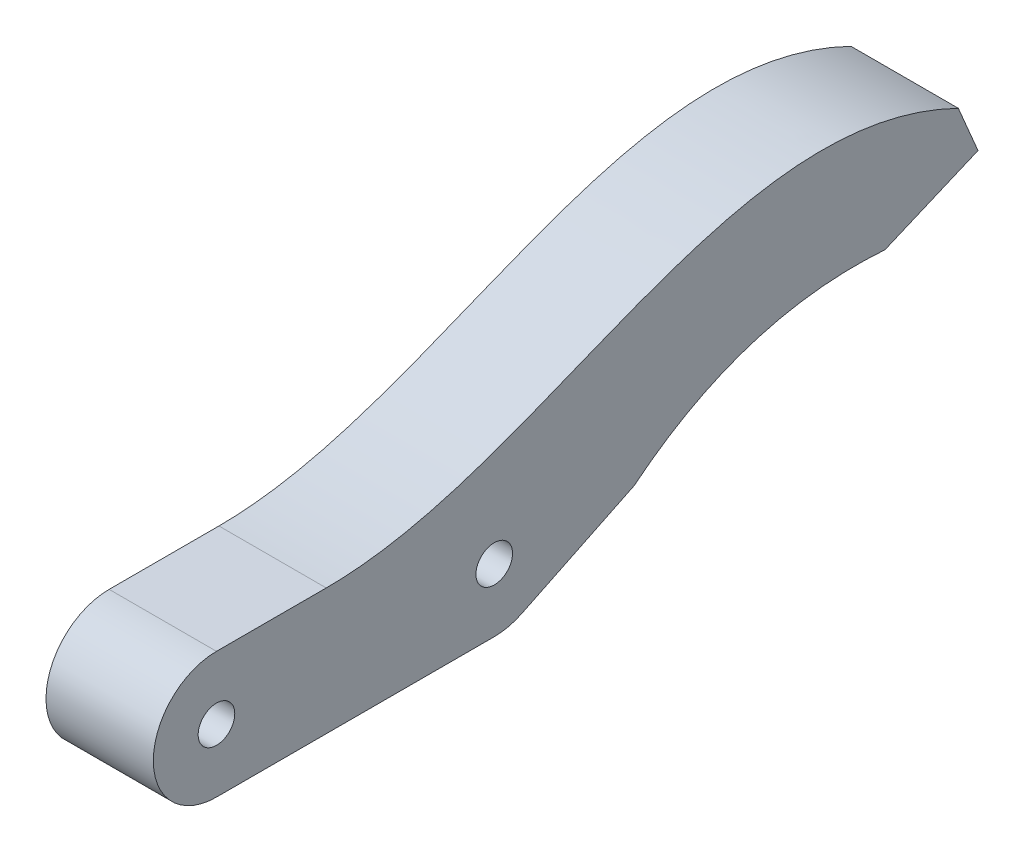
ISO-10303-21;
HEADER;
FILE_DESCRIPTION(('STEP AP214'),'2;1');
FILE_NAME('part.step','',(''),(''),'','','');
FILE_SCHEMA(('AUTOMOTIVE_DESIGN { 1 0 10303 214 1 1 1 1 }'));
ENDSEC;
DATA;
#1=APPLICATION_CONTEXT('core data for automotive mechanical design processes');
#2=APPLICATION_PROTOCOL_DEFINITION('international standard','automotive_design',2000,#1);
#3=PRODUCT_CONTEXT('',#1,'mechanical');
#4=PRODUCT('Part','Part','',(#3));
#5=PRODUCT_RELATED_PRODUCT_CATEGORY('part','',(#4));
#6=PRODUCT_DEFINITION_FORMATION('','',#4);
#7=PRODUCT_DEFINITION_CONTEXT('part definition',#1,'design');
#8=PRODUCT_DEFINITION('design','',#6,#7);
#9=PRODUCT_DEFINITION_SHAPE('','',#8);
#10=(LENGTH_UNIT() NAMED_UNIT(*) SI_UNIT(.MILLI.,.METRE.));
#11=(NAMED_UNIT(*) PLANE_ANGLE_UNIT() SI_UNIT($,.RADIAN.));
#12=(NAMED_UNIT(*) SI_UNIT($,.STERADIAN.) SOLID_ANGLE_UNIT());
#13=UNCERTAINTY_MEASURE_WITH_UNIT(LENGTH_MEASURE(1.E-05),#10,'distance_accuracy_value','');
#14=(GEOMETRIC_REPRESENTATION_CONTEXT(3) GLOBAL_UNCERTAINTY_ASSIGNED_CONTEXT((#13)) GLOBAL_UNIT_ASSIGNED_CONTEXT((#10,
#11,#12)) REPRESENTATION_CONTEXT('',''));
#15=CARTESIAN_POINT('',(0.,0.,0.));
#16=DIRECTION('',(0.,0.,1.));
#17=DIRECTION('',(1.,0.,0.));
#18=AXIS2_PLACEMENT_3D('',#15,#16,#17);
#19=CARTESIAN_POINT('',(8.5,5.,-27.));
#20=DIRECTION('',(-1.,0.,0.));
#21=DIRECTION('',(0.,0.,1.));
#22=AXIS2_PLACEMENT_3D('',#19,#20,#21);
#23=CYLINDRICAL_SURFACE('',#22,5.);
#24=DIRECTION('',(1.,0.,0.));
#25=VECTOR('',#24,1.);
#26=CARTESIAN_POINT('',(0.,0.502127655445501,-29.1838370754458));
#27=LINE('',#26,#25);
#28=CARTESIAN_POINT('',(0.,0.502127655445501,-29.1838370754458));
#29=VERTEX_POINT('',#28);
#30=CARTESIAN_POINT('',(8.5,0.502127655445501,-29.1838370754458));
#31=VERTEX_POINT('',#30);
#32=EDGE_CURVE('E197',#29,#31,#27,.T.);
#33=ORIENTED_EDGE('',*,*,#32,.T.);
#34=CARTESIAN_POINT('',(8.5,5.,-27.));
#35=DIRECTION('',(1.,0.,0.));
#36=DIRECTION('',(0.,0.,-1.));
#37=AXIS2_PLACEMENT_3D('',#34,#35,#36);
#38=CIRCLE('',#37,5.);
#39=CARTESIAN_POINT('',(8.5,0.,-27.));
#40=VERTEX_POINT('',#39);
#41=EDGE_CURVE('E209',#40,#31,#38,.T.);
#42=ORIENTED_EDGE('',*,*,#41,.F.);
#43=DIRECTION('',(-1.,0.,0.));
#44=VECTOR('',#43,1.);
#45=CARTESIAN_POINT('',(8.5,0.,-27.));
#46=LINE('',#45,#44);
#47=CARTESIAN_POINT('',(0.,0.,-27.));
#48=VERTEX_POINT('',#47);
#49=EDGE_CURVE('E217',#40,#48,#46,.T.);
#50=ORIENTED_EDGE('',*,*,#49,.T.);
#51=CARTESIAN_POINT('',(0.,5.,-27.));
#52=DIRECTION('',(1.,0.,0.));
#53=DIRECTION('',(0.,0.,-1.));
#54=AXIS2_PLACEMENT_3D('',#51,#52,#53);
#55=CIRCLE('',#54,5.);
#56=EDGE_CURVE('E221',#48,#29,#55,.T.);
#57=ORIENTED_EDGE('',*,*,#56,.T.);
#58=EDGE_LOOP('',(#33,#42,#50,#57));
#59=FACE_BOUND('',#58,.T.);
#60=ADVANCED_FACE('F42',(#59),#23,.T.);
#61=CARTESIAN_POINT('',(8.5,10.,0.));
#62=DIRECTION('',(0.,1.,0.));
#63=DIRECTION('',(0.,0.,1.));
#64=AXIS2_PLACEMENT_3D('',#61,#62,#63);
#65=PLANE('',#64);
#66=DIRECTION('',(1.,0.,0.));
#67=VECTOR('',#66,1.);
#68=CARTESIAN_POINT('',(0.,10.,-13.6949747586838));
#69=LINE('',#68,#67);
#70=CARTESIAN_POINT('',(0.,10.,-13.6949747586838));
#71=VERTEX_POINT('',#70);
#72=CARTESIAN_POINT('',(8.5,10.,-13.6949747586838));
#73=VERTEX_POINT('',#72);
#74=EDGE_CURVE('E132',#71,#73,#69,.T.);
#75=ORIENTED_EDGE('',*,*,#74,.F.);
#76=DIRECTION('',(0.,0.,-1.));
#77=VECTOR('',#76,1.);
#78=CARTESIAN_POINT('',(0.,10.,0.));
#79=LINE('',#78,#77);
#80=CARTESIAN_POINT('',(0.,10.,-5.));
#81=VERTEX_POINT('',#80);
#82=EDGE_CURVE('E143',#81,#71,#79,.T.);
#83=ORIENTED_EDGE('',*,*,#82,.F.);
#84=DIRECTION('',(-1.,0.,0.));
#85=VECTOR('',#84,1.);
#86=CARTESIAN_POINT('',(8.5,10.,-5.));
#87=LINE('',#86,#85);
#88=CARTESIAN_POINT('',(8.5,10.,-5.));
#89=VERTEX_POINT('',#88);
#90=EDGE_CURVE('E11',#89,#81,#87,.T.);
#91=ORIENTED_EDGE('',*,*,#90,.F.);
#92=DIRECTION('',(0.,0.,-1.));
#93=VECTOR('',#92,1.);
#94=CARTESIAN_POINT('',(8.5,10.,0.));
#95=LINE('',#94,#93);
#96=EDGE_CURVE('E196',#89,#73,#95,.T.);
#97=ORIENTED_EDGE('',*,*,#96,.T.);
#98=EDGE_LOOP('',(#75,#83,#91,#97));
#99=FACE_BOUND('',#98,.T.);
#100=ADVANCED_FACE('F44',(#99),#65,.T.);
#101=CARTESIAN_POINT('',(8.5,5.,-5.));
#102=DIRECTION('',(-1.,0.,0.));
#103=DIRECTION('',(0.,0.,1.));
#104=AXIS2_PLACEMENT_3D('',#101,#102,#103);
#105=CYLINDRICAL_SURFACE('',#104,5.);
#106=CARTESIAN_POINT('',(0.,5.,-5.));
#107=DIRECTION('',(1.,0.,0.));
#108=DIRECTION('',(0.,0.,-1.));
#109=AXIS2_PLACEMENT_3D('',#106,#107,#108);
#110=CIRCLE('',#109,5.);
#111=CARTESIAN_POINT('',(0.,0.,-5.));
#112=VERTEX_POINT('',#111);
#113=EDGE_CURVE('E72',#81,#112,#110,.T.);
#114=ORIENTED_EDGE('',*,*,#113,.T.);
#115=DIRECTION('',(-1.,0.,0.));
#116=VECTOR('',#115,1.);
#117=CARTESIAN_POINT('',(8.5,0.,-5.));
#118=LINE('',#117,#116);
#119=CARTESIAN_POINT('',(8.5,0.,-5.));
#120=VERTEX_POINT('',#119);
#121=EDGE_CURVE('E51',#120,#112,#118,.T.);
#122=ORIENTED_EDGE('',*,*,#121,.F.);
#123=CARTESIAN_POINT('',(8.5,5.,-5.));
#124=DIRECTION('',(1.,0.,0.));
#125=DIRECTION('',(0.,0.,-1.));
#126=AXIS2_PLACEMENT_3D('',#123,#124,#125);
#127=CIRCLE('',#126,5.);
#128=EDGE_CURVE('E205',#89,#120,#127,.T.);
#129=ORIENTED_EDGE('',*,*,#128,.F.);
#130=ORIENTED_EDGE('',*,*,#90,.T.);
#131=EDGE_LOOP('',(#114,#122,#129,#130));
#132=FACE_BOUND('',#131,.T.);
#133=ADVANCED_FACE('F188',(#132),#105,.T.);
#134=CARTESIAN_POINT('',(8.5,0.,0.));
#135=DIRECTION('',(0.,1.,0.));
#136=DIRECTION('',(0.,0.,1.));
#137=AXIS2_PLACEMENT_3D('',#134,#135,#136);
#138=PLANE('',#137);
#139=DIRECTION('',(0.,0.,-1.));
#140=VECTOR('',#139,1.);
#141=CARTESIAN_POINT('',(0.,0.,0.));
#142=LINE('',#141,#140);
#143=EDGE_CURVE('E77',#112,#48,#142,.T.);
#144=ORIENTED_EDGE('',*,*,#143,.T.);
#145=ORIENTED_EDGE('',*,*,#49,.F.);
#146=DIRECTION('',(0.,0.,-1.));
#147=VECTOR('',#146,1.);
#148=CARTESIAN_POINT('',(8.5,0.,0.));
#149=LINE('',#148,#147);
#150=EDGE_CURVE('E59',#120,#40,#149,.T.);
#151=ORIENTED_EDGE('',*,*,#150,.F.);
#152=ORIENTED_EDGE('',*,*,#121,.T.);
#153=EDGE_LOOP('',(#144,#145,#151,#152));
#154=FACE_BOUND('',#153,.T.);
#155=ADVANCED_FACE('F182',(#154),#138,.F.);
#156=CARTESIAN_POINT('',(8.5,5.,-5.));
#157=DIRECTION('',(-1.,0.,0.));
#158=DIRECTION('',(0.,0.,1.));
#159=AXIS2_PLACEMENT_3D('',#156,#157,#158);
#160=CYLINDRICAL_SURFACE('',#159,1.45);
#161=CARTESIAN_POINT('',(8.5,5.,-5.));
#162=DIRECTION('',(1.,0.,0.));
#163=DIRECTION('',(0.,0.,-1.));
#164=AXIS2_PLACEMENT_3D('',#161,#162,#163);
#165=CIRCLE('',#164,1.45);
#166=CARTESIAN_POINT('',(8.5,5.,-6.45));
#167=VERTEX_POINT('',#166);
#168=EDGE_CURVE('E211',#167,#167,#165,.T.);
#169=ORIENTED_EDGE('',*,*,#168,.T.);
#170=EDGE_LOOP('',(#169));
#171=FACE_BOUND('',#170,.T.);
#172=CARTESIAN_POINT('',(0.,5.,-5.));
#173=DIRECTION('',(1.,0.,0.));
#174=DIRECTION('',(0.,0.,-1.));
#175=AXIS2_PLACEMENT_3D('',#172,#173,#174);
#176=CIRCLE('',#175,1.45);
#177=CARTESIAN_POINT('',(0.,5.,-6.45));
#178=VERTEX_POINT('',#177);
#179=EDGE_CURVE('E224',#178,#178,#176,.T.);
#180=ORIENTED_EDGE('',*,*,#179,.F.);
#181=EDGE_LOOP('',(#180));
#182=FACE_BOUND('',#181,.T.);
#183=ADVANCED_FACE('F178',(#171,#182),#160,.F.);
#184=CARTESIAN_POINT('',(8.5,5.,-27.));
#185=DIRECTION('',(-1.,0.,0.));
#186=DIRECTION('',(0.,0.,1.));
#187=AXIS2_PLACEMENT_3D('',#184,#185,#186);
#188=CYLINDRICAL_SURFACE('',#187,1.45);
#189=CARTESIAN_POINT('',(8.5,5.,-27.));
#190=DIRECTION('',(1.,0.,0.));
#191=DIRECTION('',(0.,0.,-1.));
#192=AXIS2_PLACEMENT_3D('',#189,#190,#191);
#193=CIRCLE('',#192,1.45);
#194=CARTESIAN_POINT('',(8.5,5.,-28.45));
#195=VERTEX_POINT('',#194);
#196=EDGE_CURVE('E214',#195,#195,#193,.T.);
#197=ORIENTED_EDGE('',*,*,#196,.T.);
#198=EDGE_LOOP('',(#197));
#199=FACE_BOUND('',#198,.T.);
#200=CARTESIAN_POINT('',(0.,5.,-27.));
#201=DIRECTION('',(1.,0.,0.));
#202=DIRECTION('',(0.,0.,-1.));
#203=AXIS2_PLACEMENT_3D('',#200,#201,#202);
#204=CIRCLE('',#203,1.45);
#205=CARTESIAN_POINT('',(0.,5.,-28.45));
#206=VERTEX_POINT('',#205);
#207=EDGE_CURVE('E206',#206,#206,#204,.T.);
#208=ORIENTED_EDGE('',*,*,#207,.F.);
#209=EDGE_LOOP('',(#208));
#210=FACE_BOUND('',#209,.T.);
#211=ADVANCED_FACE('F173',(#199,#210),#188,.F.);
#212=CARTESIAN_POINT('',(8.5,0.,0.));
#213=DIRECTION('',(1.,0.,0.));
#214=DIRECTION('',(0.,0.,-1.));
#215=AXIS2_PLACEMENT_3D('',#212,#213,#214);
#216=PLANE('',#215);
#217=ORIENTED_EDGE('',*,*,#96,.F.);
#218=ORIENTED_EDGE('',*,*,#128,.T.);
#219=ORIENTED_EDGE('',*,*,#150,.T.);
#220=ORIENTED_EDGE('',*,*,#41,.T.);
#221=DIRECTION('',(0.,0.436767415089167,-0.8995744689109));
#222=VECTOR('',#221,1.);
#223=CARTESIAN_POINT('',(8.5,-11.0601312365663,-5.36998891997289));
#224=LINE('',#223,#222);
#225=CARTESIAN_POINT('',(8.5,4.82408407678908,-38.0854206599091));
#226=VERTEX_POINT('',#225);
#227=EDGE_CURVE('E237',#31,#226,#224,.T.);
#228=ORIENTED_EDGE('',*,*,#227,.T.);
#229=CARTESIAN_POINT('',(8.5,4.82408407678908,-38.0854206599091));
#230=CARTESIAN_POINT('',(8.5,11.8952224566425,-46.7975095094647));
#231=CARTESIAN_POINT('',(8.5,11.0678436667493,-57.9480004086976));
#232=B_SPLINE_CURVE_WITH_KNOTS('',2,(#229,#230,#231),.UNSPECIFIED.,.F.,.F.,(3,3),(0.,1.),.UNSPECIFIED.);
#233=CARTESIAN_POINT('',(8.5,11.0678436667493,-57.9480004086976));
#234=VERTEX_POINT('',#233);
#235=EDGE_CURVE('E151',#226,#234,#232,.T.);
#236=ORIENTED_EDGE('',*,*,#235,.T.);
#237=DIRECTION('',(0.,0.39020935118337,-0.920726160293631));
#238=VECTOR('',#237,1.);
#239=CARTESIAN_POINT('',(8.5,-11.4367064909869,-4.84694582599828));
#240=LINE('',#239,#238);
#241=CARTESIAN_POINT('',(8.5,14.1895184762162,-65.3138096910467));
#242=VERTEX_POINT('',#241);
#243=EDGE_CURVE('E148',#234,#242,#240,.T.);
#244=ORIENTED_EDGE('',*,*,#243,.T.);
#245=DIRECTION('',(0.,0.920726160293631,0.39020935118337));
#246=VECTOR('',#245,1.);
#247=CARTESIAN_POINT('',(8.5,25.6262249672031,-60.4668638650484));
#248=LINE('',#247,#246);
#249=CARTESIAN_POINT('',(8.5,17.8724231173908,-63.7529722863132));
#250=VERTEX_POINT('',#249);
#251=EDGE_CURVE('E243',#242,#250,#248,.T.);
#252=ORIENTED_EDGE('',*,*,#251,.T.);
#253=CARTESIAN_POINT('',(8.5,17.8724231173908,-63.7529722863132));
#254=CARTESIAN_POINT('',(8.5,26.563787962677,-45.9288826779558));
#255=CARTESIAN_POINT('',(8.5,9.99999999999999,-31.059268620705));
#256=CARTESIAN_POINT('',(8.5,10.,-13.6949747586838));
#257=B_SPLINE_CURVE_WITH_KNOTS('',3,(#253,#254,#255,#256),.UNSPECIFIED.,.F.,.F.,(4,4),(0.,1.),.UNSPECIFIED.);
#258=EDGE_CURVE('E127',#250,#73,#257,.T.);
#259=ORIENTED_EDGE('',*,*,#258,.T.);
#260=EDGE_LOOP('',(#217,#218,#219,#220,#228,#236,#244,#252,#259));
#261=FACE_BOUND('',#260,.T.);
#262=ORIENTED_EDGE('',*,*,#168,.F.);
#263=EDGE_LOOP('',(#262));
#264=FACE_BOUND('',#263,.T.);
#265=ORIENTED_EDGE('',*,*,#196,.F.);
#266=EDGE_LOOP('',(#265));
#267=FACE_BOUND('',#266,.T.);
#268=ADVANCED_FACE('F170',(#261,#264,#267),#216,.T.);
#269=CARTESIAN_POINT('',(0.,0.,0.));
#270=DIRECTION('',(1.,0.,0.));
#271=DIRECTION('',(0.,0.,-1.));
#272=AXIS2_PLACEMENT_3D('',#269,#270,#271);
#273=PLANE('',#272);
#274=ORIENTED_EDGE('',*,*,#82,.T.);
#275=CARTESIAN_POINT('',(0.,17.8724231173908,-63.7529722863132));
#276=CARTESIAN_POINT('',(0.,26.563787962677,-45.9288826779558));
#277=CARTESIAN_POINT('',(0.,9.99999999999999,-31.059268620705));
#278=CARTESIAN_POINT('',(0.,10.,-13.6949747586838));
#279=B_SPLINE_CURVE_WITH_KNOTS('',3,(#275,#276,#277,#278),.UNSPECIFIED.,.F.,.F.,(4,4),(0.,1.),.UNSPECIFIED.);
#280=CARTESIAN_POINT('',(0.,17.8724231173908,-63.7529722863132));
#281=VERTEX_POINT('',#280);
#282=EDGE_CURVE('E124',#281,#71,#279,.T.);
#283=ORIENTED_EDGE('',*,*,#282,.F.);
#284=DIRECTION('',(0.,0.920726160293631,0.39020935118337));
#285=VECTOR('',#284,1.);
#286=CARTESIAN_POINT('',(0.,25.6262249672031,-60.4668638650484));
#287=LINE('',#286,#285);
#288=CARTESIAN_POINT('',(0.,14.1895184762162,-65.3138096910467));
#289=VERTEX_POINT('',#288);
#290=EDGE_CURVE('E141',#289,#281,#287,.T.);
#291=ORIENTED_EDGE('',*,*,#290,.F.);
#292=DIRECTION('',(0.,0.39020935118337,-0.920726160293631));
#293=VECTOR('',#292,1.);
#294=CARTESIAN_POINT('',(0.,-11.4367064909869,-4.84694582599828));
#295=LINE('',#294,#293);
#296=CARTESIAN_POINT('',(0.,11.0678436667493,-57.9480004086976));
#297=VERTEX_POINT('',#296);
#298=EDGE_CURVE('E133',#297,#289,#295,.T.);
#299=ORIENTED_EDGE('',*,*,#298,.F.);
#300=CARTESIAN_POINT('',(0.,4.82408407678908,-38.0854206599091));
#301=CARTESIAN_POINT('',(0.,11.8952224566425,-46.7975095094647));
#302=CARTESIAN_POINT('',(0.,11.0678436667493,-57.9480004086976));
#303=B_SPLINE_CURVE_WITH_KNOTS('',2,(#300,#301,#302),.UNSPECIFIED.,.F.,.F.,(3,3),(0.,1.),.UNSPECIFIED.);
#304=CARTESIAN_POINT('',(0.,4.82408407678908,-38.0854206599091));
#305=VERTEX_POINT('',#304);
#306=EDGE_CURVE('E259',#305,#297,#303,.T.);
#307=ORIENTED_EDGE('',*,*,#306,.F.);
#308=DIRECTION('',(0.,0.436767415089167,-0.8995744689109));
#309=VECTOR('',#308,1.);
#310=CARTESIAN_POINT('',(0.,-11.0601312365663,-5.36998891997289));
#311=LINE('',#310,#309);
#312=EDGE_CURVE('E144',#29,#305,#311,.T.);
#313=ORIENTED_EDGE('',*,*,#312,.F.);
#314=ORIENTED_EDGE('',*,*,#56,.F.);
#315=ORIENTED_EDGE('',*,*,#143,.F.);
#316=ORIENTED_EDGE('',*,*,#113,.F.);
#317=EDGE_LOOP('',(#274,#283,#291,#299,#307,#313,#314,#315,#316));
#318=FACE_BOUND('',#317,.T.);
#319=ORIENTED_EDGE('',*,*,#179,.T.);
#320=EDGE_LOOP('',(#319));
#321=FACE_BOUND('',#320,.T.);
#322=ORIENTED_EDGE('',*,*,#207,.T.);
#323=EDGE_LOOP('',(#322));
#324=FACE_BOUND('',#323,.T.);
#325=ADVANCED_FACE('F138',(#318,#321,#324),#273,.F.);
#326=CARTESIAN_POINT('',(0.,25.6262249672031,-60.4668638650484));
#327=DIRECTION('',(0.,0.39020935118337,-0.920726160293631));
#328=DIRECTION('',(0.,0.920726160293631,0.39020935118337));
#329=AXIS2_PLACEMENT_3D('',#326,#327,#328);
#330=PLANE('',#329);
#331=ORIENTED_EDGE('',*,*,#251,.F.);
#332=DIRECTION('',(1.,0.,0.));
#333=VECTOR('',#332,1.);
#334=CARTESIAN_POINT('',(0.,14.1895184762162,-65.3138096910467));
#335=LINE('',#334,#333);
#336=EDGE_CURVE('E147',#289,#242,#335,.T.);
#337=ORIENTED_EDGE('',*,*,#336,.F.);
#338=ORIENTED_EDGE('',*,*,#290,.T.);
#339=DIRECTION('',(1.,0.,0.));
#340=VECTOR('',#339,1.);
#341=CARTESIAN_POINT('',(0.,17.8724231173908,-63.7529722863132));
#342=LINE('',#341,#340);
#343=EDGE_CURVE('E121',#281,#250,#342,.T.);
#344=ORIENTED_EDGE('',*,*,#343,.T.);
#345=EDGE_LOOP('',(#331,#337,#338,#344));
#346=FACE_BOUND('',#345,.T.);
#347=ADVANCED_FACE('F146',(#346),#330,.T.);
#348=CARTESIAN_POINT('',(0.,-11.4367064909869,-4.84694582599828));
#349=DIRECTION('',(0.,-0.920726160293631,-0.39020935118337));
#350=DIRECTION('',(0.,0.39020935118337,-0.920726160293631));
#351=AXIS2_PLACEMENT_3D('',#348,#349,#350);
#352=PLANE('',#351);
#353=ORIENTED_EDGE('',*,*,#243,.F.);
#354=DIRECTION('',(1.,0.,0.));
#355=VECTOR('',#354,1.);
#356=CARTESIAN_POINT('',(0.,11.0678436667493,-57.9480004086976));
#357=LINE('',#356,#355);
#358=EDGE_CURVE('E255',#297,#234,#357,.T.);
#359=ORIENTED_EDGE('',*,*,#358,.F.);
#360=ORIENTED_EDGE('',*,*,#298,.T.);
#361=ORIENTED_EDGE('',*,*,#336,.T.);
#362=EDGE_LOOP('',(#353,#359,#360,#361));
#363=FACE_BOUND('',#362,.T.);
#364=ADVANCED_FACE('F169',(#363),#352,.T.);
#365=DIRECTION('',(1.,0.,0.));
#366=VECTOR('',#365,1.);
#367=SURFACE_OF_LINEAR_EXTRUSION('',#303,#366);
#368=ORIENTED_EDGE('',*,*,#235,.F.);
#369=DIRECTION('',(1.,0.,0.));
#370=VECTOR('',#369,1.);
#371=CARTESIAN_POINT('',(0.,4.82408407678908,-38.0854206599091));
#372=LINE('',#371,#370);
#373=EDGE_CURVE('E200',#305,#226,#372,.T.);
#374=ORIENTED_EDGE('',*,*,#373,.F.);
#375=ORIENTED_EDGE('',*,*,#306,.T.);
#376=ORIENTED_EDGE('',*,*,#358,.T.);
#377=EDGE_LOOP('',(#368,#374,#375,#376));
#378=FACE_BOUND('',#377,.T.);
#379=ADVANCED_FACE('F258',(#378),#367,.T.);
#380=CARTESIAN_POINT('',(0.,-11.0601312365663,-5.36998891997289));
#381=DIRECTION('',(0.,-0.8995744689109,-0.436767415089167));
#382=DIRECTION('',(0.,0.436767415089167,-0.8995744689109));
#383=AXIS2_PLACEMENT_3D('',#380,#381,#382);
#384=PLANE('',#383);
#385=ORIENTED_EDGE('',*,*,#227,.F.);
#386=ORIENTED_EDGE('',*,*,#32,.F.);
#387=ORIENTED_EDGE('',*,*,#312,.T.);
#388=ORIENTED_EDGE('',*,*,#373,.T.);
#389=EDGE_LOOP('',(#385,#386,#387,#388));
#390=FACE_BOUND('',#389,.T.);
#391=ADVANCED_FACE('F165',(#390),#384,.T.);
#392=DIRECTION('',(1.,0.,0.));
#393=VECTOR('',#392,1.);
#394=SURFACE_OF_LINEAR_EXTRUSION('',#279,#393);
#395=ORIENTED_EDGE('',*,*,#258,.F.);
#396=ORIENTED_EDGE('',*,*,#343,.F.);
#397=ORIENTED_EDGE('',*,*,#282,.T.);
#398=ORIENTED_EDGE('',*,*,#74,.T.);
#399=EDGE_LOOP('',(#395,#396,#397,#398));
#400=FACE_BOUND('',#399,.T.);
#401=ADVANCED_FACE('F123',(#400),#394,.T.);
#402=CLOSED_SHELL('',(#60,#100,#133,#155,#183,#211,#268,#325,#347,#364,#379,#391,#401));
#403=MANIFOLD_SOLID_BREP('B2',#402);
#404=ADVANCED_BREP_SHAPE_REPRESENTATION('',(#18,#403),#14);
#405=SHAPE_DEFINITION_REPRESENTATION(#9,#404);
ENDSEC;
END-ISO-10303-21;
